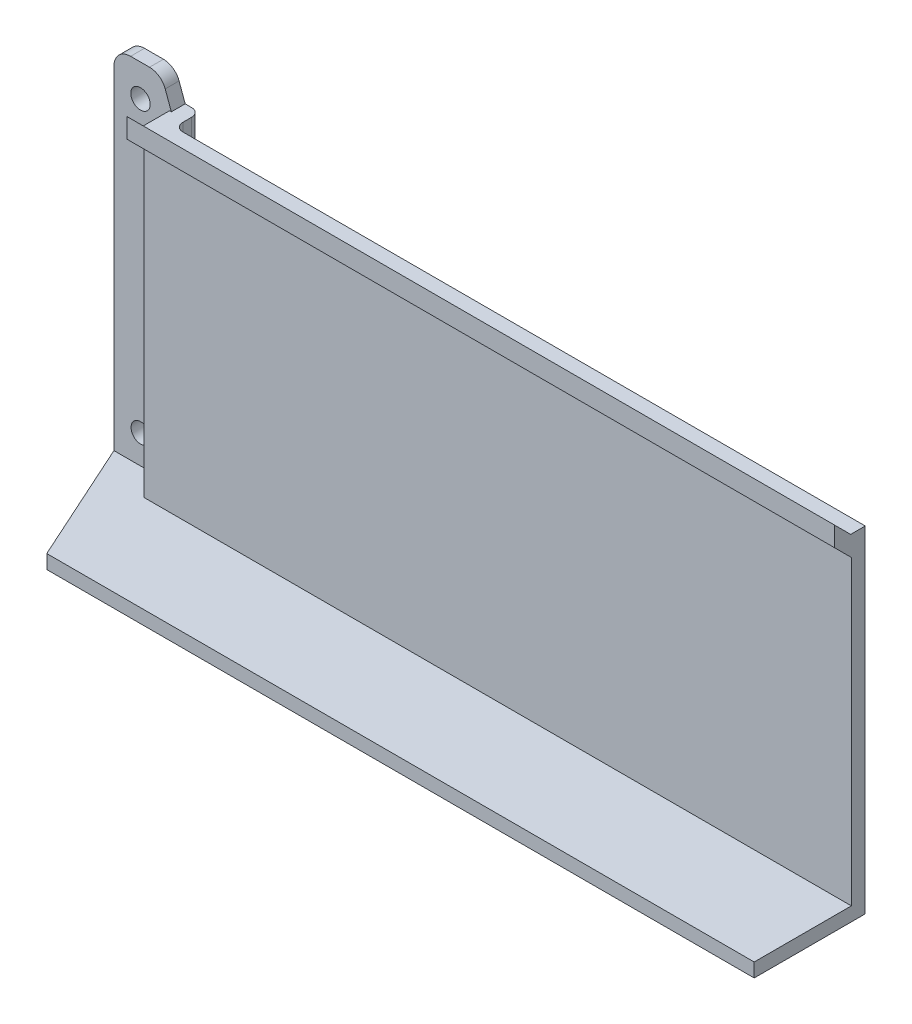
ISO-10303-21;
HEADER;
FILE_DESCRIPTION(('STEP AP214'),'2;1');
FILE_NAME('part.step','',(''),(''),'','','');
FILE_SCHEMA(('AUTOMOTIVE_DESIGN { 1 0 10303 214 1 1 1 1 }'));
ENDSEC;
DATA;
#1=APPLICATION_CONTEXT('core data for automotive mechanical design processes');
#2=APPLICATION_PROTOCOL_DEFINITION('international standard','automotive_design',2000,#1);
#3=PRODUCT_CONTEXT('',#1,'mechanical');
#4=PRODUCT('Part','Part','',(#3));
#5=PRODUCT_RELATED_PRODUCT_CATEGORY('part','',(#4));
#6=PRODUCT_DEFINITION_FORMATION('','',#4);
#7=PRODUCT_DEFINITION_CONTEXT('part definition',#1,'design');
#8=PRODUCT_DEFINITION('design','',#6,#7);
#9=PRODUCT_DEFINITION_SHAPE('','',#8);
#10=(LENGTH_UNIT() NAMED_UNIT(*) SI_UNIT(.MILLI.,.METRE.));
#11=(NAMED_UNIT(*) PLANE_ANGLE_UNIT() SI_UNIT($,.RADIAN.));
#12=(NAMED_UNIT(*) SI_UNIT($,.STERADIAN.) SOLID_ANGLE_UNIT());
#13=UNCERTAINTY_MEASURE_WITH_UNIT(LENGTH_MEASURE(1.E-05),#10,'distance_accuracy_value','');
#14=(GEOMETRIC_REPRESENTATION_CONTEXT(3) GLOBAL_UNCERTAINTY_ASSIGNED_CONTEXT((#13)) GLOBAL_UNIT_ASSIGNED_CONTEXT((#10,
#11,#12)) REPRESENTATION_CONTEXT('',''));
#15=CARTESIAN_POINT('',(0.,0.,0.));
#16=DIRECTION('',(0.,0.,1.));
#17=DIRECTION('',(1.,0.,0.));
#18=AXIS2_PLACEMENT_3D('',#15,#16,#17);
#19=CARTESIAN_POINT('',(273.3,-77.8,42.));
#20=DIRECTION('',(0.911071059253296,0.,-0.412249348078414));
#21=DIRECTION('',(0.,-1.,0.));
#22=AXIS2_PLACEMENT_3D('',#19,#20,#21);
#23=PLANE('',#22);
#24=DIRECTION('',(0.412249348078414,0.,0.911071059253296));
#25=VECTOR('',#24,1.);
#26=CARTESIAN_POINT('',(263.3,-77.8,19.9));
#27=LINE('',#26,#25);
#28=CARTESIAN_POINT('',(263.3,-77.8,19.9));
#29=VERTEX_POINT('',#28);
#30=CARTESIAN_POINT('',(273.3,-77.8,42.));
#31=VERTEX_POINT('',#30);
#32=EDGE_CURVE('E280',#29,#31,#27,.T.);
#33=ORIENTED_EDGE('',*,*,#32,.T.);
#34=DIRECTION('',(0.,1.,0.));
#35=VECTOR('',#34,1.);
#36=CARTESIAN_POINT('',(273.3,-61.952070743768,42.));
#37=LINE('',#36,#35);
#38=CARTESIAN_POINT('',(273.3,-75.3,42.));
#39=VERTEX_POINT('',#38);
#40=EDGE_CURVE('E435',#31,#39,#37,.T.);
#41=ORIENTED_EDGE('',*,*,#40,.T.);
#42=DIRECTION('',(-0.412249348078414,0.,-0.911071059253296));
#43=VECTOR('',#42,1.);
#44=CARTESIAN_POINT('',(263.3,-75.3,19.9));
#45=LINE('',#44,#43);
#46=CARTESIAN_POINT('',(263.3,-75.3,19.9));
#47=VERTEX_POINT('',#46);
#48=EDGE_CURVE('E193',#39,#47,#45,.T.);
#49=ORIENTED_EDGE('',*,*,#48,.T.);
#50=DIRECTION('',(0.,1.,0.));
#51=VECTOR('',#50,1.);
#52=CARTESIAN_POINT('',(263.3,-77.8,19.9));
#53=LINE('',#52,#51);
#54=EDGE_CURVE('E42',#29,#47,#53,.T.);
#55=ORIENTED_EDGE('',*,*,#54,.F.);
#56=EDGE_LOOP('',(#33,#41,#49,#55));
#57=FACE_BOUND('',#56,.T.);
#58=ADVANCED_FACE('F17',(#57),#23,.F.);
#59=CARTESIAN_POINT('',(267.15,-12.3,18.65));
#60=DIRECTION('',(0.,-1.,0.));
#61=DIRECTION('',(0.,0.,-1.));
#62=AXIS2_PLACEMENT_3D('',#59,#60,#61);
#63=PLANE('',#62);
#64=DIRECTION('',(0.,0.,1.));
#65=VECTOR('',#64,1.);
#66=CARTESIAN_POINT('',(266.3,-12.3,19.275));
#67=LINE('',#66,#65);
#68=CARTESIAN_POINT('',(266.3,-12.3,17.4));
#69=VERTEX_POINT('',#68);
#70=CARTESIAN_POINT('',(266.3,-12.3,19.9));
#71=VERTEX_POINT('',#70);
#72=EDGE_CURVE('E356',#69,#71,#67,.T.);
#73=ORIENTED_EDGE('',*,*,#72,.T.);
#74=DIRECTION('',(-1.,0.,0.));
#75=VECTOR('',#74,1.);
#76=CARTESIAN_POINT('',(261.3,-12.3,19.9));
#77=LINE('',#76,#75);
#78=CARTESIAN_POINT('',(269.712151148817,-12.3,19.9));
#79=VERTEX_POINT('',#78);
#80=EDGE_CURVE('E311',#79,#71,#77,.T.);
#81=ORIENTED_EDGE('',*,*,#80,.F.);
#82=DIRECTION('',(0.,0.,-1.));
#83=VECTOR('',#82,1.);
#84=CARTESIAN_POINT('',(269.712151148817,-12.3,18.025));
#85=LINE('',#84,#83);
#86=CARTESIAN_POINT('',(269.712151148817,-12.3,17.4));
#87=VERTEX_POINT('',#86);
#88=EDGE_CURVE('E278',#79,#87,#85,.T.);
#89=ORIENTED_EDGE('',*,*,#88,.T.);
#90=DIRECTION('',(1.,0.,0.));
#91=VECTOR('',#90,1.);
#92=CARTESIAN_POINT('',(273.,-12.3,17.4));
#93=LINE('',#92,#91);
#94=EDGE_CURVE('E11',#69,#87,#93,.T.);
#95=ORIENTED_EDGE('',*,*,#94,.F.);
#96=EDGE_LOOP('',(#73,#81,#89,#95));
#97=FACE_BOUND('',#96,.T.);
#98=ADVANCED_FACE('F721',(#97),#63,.F.);
#99=CARTESIAN_POINT('',(261.3,-77.8,17.4));
#100=DIRECTION('',(0.,0.,1.));
#101=DIRECTION('',(0.,-1.,0.));
#102=AXIS2_PLACEMENT_3D('',#99,#100,#101);
#103=PLANE('',#102);
#104=CARTESIAN_POINT('',(268.081503569987,-18.0495388462358,17.4));
#105=DIRECTION('',(0.,0.,-1.));
#106=DIRECTION('',(1.,0.,0.));
#107=AXIS2_PLACEMENT_3D('',#104,#105,#106);
#108=CIRCLE('',#107,1.74999999999997);
#109=CARTESIAN_POINT('',(266.331503569987,-18.0495388462358,17.4));
#110=VERTEX_POINT('',#109);
#111=EDGE_CURVE('E398',#110,#110,#108,.T.);
#112=ORIENTED_EDGE('',*,*,#111,.F.);
#113=EDGE_LOOP('',(#112));
#114=FACE_BOUND('',#113,.T.);
#115=CARTESIAN_POINT('',(268.132358944298,-70.1323589442977,17.4));
#116=DIRECTION('',(0.,0.,-1.));
#117=DIRECTION('',(1.,0.,0.));
#118=AXIS2_PLACEMENT_3D('',#115,#116,#117);
#119=CIRCLE('',#118,1.74999999999997);
#120=CARTESIAN_POINT('',(266.382358944298,-70.1323589442977,17.4));
#121=VERTEX_POINT('',#120);
#122=EDGE_CURVE('E155',#121,#121,#119,.T.);
#123=ORIENTED_EDGE('',*,*,#122,.F.);
#124=EDGE_LOOP('',(#123));
#125=FACE_BOUND('',#124,.T.);
#126=CARTESIAN_POINT('',(266.3,-15.3,17.4));
#127=DIRECTION('',(0.,0.,-1.));
#128=DIRECTION('',(-0.707106781186554,0.707106781186541,0.));
#129=AXIS2_PLACEMENT_3D('',#126,#127,#128);
#130=CIRCLE('',#129,3.);
#131=CARTESIAN_POINT('',(263.3,-15.3,17.4));
#132=VERTEX_POINT('',#131);
#133=EDGE_CURVE('E385',#132,#69,#130,.T.);
#134=ORIENTED_EDGE('',*,*,#133,.T.);
#135=ORIENTED_EDGE('',*,*,#94,.T.);
#136=CARTESIAN_POINT('',(269.712151148817,-15.3,17.4));
#137=DIRECTION('',(0.,0.,-1.));
#138=DIRECTION('',(0.573576436351047,0.819152044288991,0.));
#139=AXIS2_PLACEMENT_3D('',#136,#137,#138);
#140=CIRCLE('',#139,3.);
#141=CARTESIAN_POINT('',(272.531229011175,-14.273939570023,17.4));
#142=VERTEX_POINT('',#141);
#143=EDGE_CURVE('E274',#87,#142,#140,.T.);
#144=ORIENTED_EDGE('',*,*,#143,.T.);
#145=DIRECTION('',(-0.342020143325669,0.939692620785908,0.));
#146=VECTOR('',#145,1.);
#147=CARTESIAN_POINT('',(273.734751190158,-17.5805895805925,17.4));
#148=LINE('',#147,#146);
#149=CARTESIAN_POINT('',(273.632624934777,-17.3,17.4));
#150=VERTEX_POINT('',#149);
#151=EDGE_CURVE('E28',#150,#142,#148,.T.);
#152=ORIENTED_EDGE('',*,*,#151,.F.);
#153=DIRECTION('',(1.,0.,0.));
#154=VECTOR('',#153,1.);
#155=CARTESIAN_POINT('',(261.3,-17.3,17.4));
#156=LINE('',#155,#154);
#157=CARTESIAN_POINT('',(274.8,-17.3,17.4));
#158=VERTEX_POINT('',#157);
#159=EDGE_CURVE('E293',#150,#158,#156,.T.);
#160=ORIENTED_EDGE('',*,*,#159,.T.);
#161=DIRECTION('',(0.,-1.,0.));
#162=VECTOR('',#161,1.);
#163=CARTESIAN_POINT('',(274.8,-77.8,17.4));
#164=LINE('',#163,#162);
#165=CARTESIAN_POINT('',(274.8,-77.8,17.4));
#166=VERTEX_POINT('',#165);
#167=EDGE_CURVE('E288',#158,#166,#164,.T.);
#168=ORIENTED_EDGE('',*,*,#167,.T.);
#169=DIRECTION('',(1.,0.,0.));
#170=VECTOR('',#169,1.);
#171=CARTESIAN_POINT('',(261.3,-77.8,17.4));
#172=LINE('',#171,#170);
#173=CARTESIAN_POINT('',(263.3,-77.8,17.4));
#174=VERTEX_POINT('',#173);
#175=EDGE_CURVE('E284',#174,#166,#172,.T.);
#176=ORIENTED_EDGE('',*,*,#175,.F.);
#177=DIRECTION('',(0.,-1.,0.));
#178=VECTOR('',#177,1.);
#179=CARTESIAN_POINT('',(263.3,-77.8,17.4));
#180=LINE('',#179,#178);
#181=EDGE_CURVE('E283',#132,#174,#180,.T.);
#182=ORIENTED_EDGE('',*,*,#181,.F.);
#183=EDGE_LOOP('',(#134,#135,#144,#152,#160,#168,#176,#182));
#184=FACE_BOUND('',#183,.T.);
#185=ADVANCED_FACE('F681',(#114,#125,#184),#103,.F.);
#186=CARTESIAN_POINT('',(273.734751190158,-17.5805895805925,17.4));
#187=DIRECTION('',(-0.939692620785908,-0.342020143325669,0.));
#188=DIRECTION('',(-0.342020143325669,0.939692620785908,0.));
#189=AXIS2_PLACEMENT_3D('',#186,#187,#188);
#190=PLANE('',#189);
#191=DIRECTION('',(0.,0.,1.));
#192=VECTOR('',#191,1.);
#193=CARTESIAN_POINT('',(272.531229011175,-14.273939570023,18.025));
#194=LINE('',#193,#192);
#195=CARTESIAN_POINT('',(272.531229011175,-14.273939570023,19.9));
#196=VERTEX_POINT('',#195);
#197=EDGE_CURVE('E279',#142,#196,#194,.T.);
#198=ORIENTED_EDGE('',*,*,#197,.T.);
#199=DIRECTION('',(-0.342020143325669,0.939692620785908,0.));
#200=VECTOR('',#199,1.);
#201=CARTESIAN_POINT('',(273.734751190158,-17.5805895805925,19.9));
#202=LINE('',#201,#200);
#203=CARTESIAN_POINT('',(273.632624934777,-17.3,19.9));
#204=VERTEX_POINT('',#203);
#205=EDGE_CURVE('E307',#204,#196,#202,.T.);
#206=ORIENTED_EDGE('',*,*,#205,.F.);
#207=DIRECTION('',(0.,0.,-1.));
#208=VECTOR('',#207,1.);
#209=CARTESIAN_POINT('',(273.632624934777,-17.3,21.0121320343554));
#210=LINE('',#209,#208);
#211=EDGE_CURVE('E318',#204,#150,#210,.T.);
#212=ORIENTED_EDGE('',*,*,#211,.T.);
#213=ORIENTED_EDGE('',*,*,#151,.T.);
#214=EDGE_LOOP('',(#198,#206,#212,#213));
#215=FACE_BOUND('',#214,.T.);
#216=ADVANCED_FACE('F726',(#215),#190,.F.);
#217=CARTESIAN_POINT('',(263.3,-77.8,19.9));
#218=DIRECTION('',(-1.,0.,0.));
#219=DIRECTION('',(0.,0.,1.));
#220=AXIS2_PLACEMENT_3D('',#217,#218,#219);
#221=PLANE('',#220);
#222=DIRECTION('',(0.,0.,-1.));
#223=VECTOR('',#222,1.);
#224=CARTESIAN_POINT('',(263.3,-15.3,19.275));
#225=LINE('',#224,#223);
#226=CARTESIAN_POINT('',(263.3,-15.3,19.9));
#227=VERTEX_POINT('',#226);
#228=EDGE_CURVE('E417',#227,#132,#225,.T.);
#229=ORIENTED_EDGE('',*,*,#228,.T.);
#230=ORIENTED_EDGE('',*,*,#181,.T.);
#231=DIRECTION('',(0.,0.,1.));
#232=VECTOR('',#231,1.);
#233=CARTESIAN_POINT('',(263.3,-77.8,20.95));
#234=LINE('',#233,#232);
#235=EDGE_CURVE('E290',#174,#29,#234,.T.);
#236=ORIENTED_EDGE('',*,*,#235,.T.);
#237=ORIENTED_EDGE('',*,*,#54,.T.);
#238=DIRECTION('',(0.,1.,0.));
#239=VECTOR('',#238,1.);
#240=CARTESIAN_POINT('',(263.3,-77.8,19.9));
#241=LINE('',#240,#239);
#242=EDGE_CURVE('E327',#47,#227,#241,.T.);
#243=ORIENTED_EDGE('',*,*,#242,.T.);
#244=EDGE_LOOP('',(#229,#230,#236,#237,#243));
#245=FACE_BOUND('',#244,.T.);
#246=ADVANCED_FACE('F676',(#245),#221,.T.);
#247=CARTESIAN_POINT('',(273.,-77.8,22.));
#248=DIRECTION('',(0.,1.,0.));
#249=DIRECTION('',(0.,0.,-1.));
#250=AXIS2_PLACEMENT_3D('',#247,#248,#249);
#251=PLANE('',#250);
#252=ORIENTED_EDGE('',*,*,#235,.F.);
#253=ORIENTED_EDGE('',*,*,#175,.T.);
#254=CARTESIAN_POINT('',(274.8,-77.8,18.9));
#255=DIRECTION('',(0.,-1.,0.));
#256=DIRECTION('',(0.707106781186542,0.,-0.707106781186553));
#257=AXIS2_PLACEMENT_3D('',#254,#255,#256);
#258=CIRCLE('',#257,1.5);
#259=CARTESIAN_POINT('',(276.3,-77.8,18.9));
#260=VERTEX_POINT('',#259);
#261=EDGE_CURVE('E285',#166,#260,#258,.T.);
#262=ORIENTED_EDGE('',*,*,#261,.T.);
#263=DIRECTION('',(0.,0.,1.));
#264=VECTOR('',#263,1.);
#265=CARTESIAN_POINT('',(276.3,-77.8,17.4));
#266=LINE('',#265,#264);
#267=CARTESIAN_POINT('',(276.3,-77.8,20.5));
#268=VERTEX_POINT('',#267);
#269=EDGE_CURVE('E183',#260,#268,#266,.T.);
#270=ORIENTED_EDGE('',*,*,#269,.T.);
#271=CARTESIAN_POINT('',(277.8,-77.8,20.5));
#272=DIRECTION('',(0.,1.,0.));
#273=DIRECTION('',(-0.707106781186542,0.,0.707106781186553));
#274=AXIS2_PLACEMENT_3D('',#271,#272,#273);
#275=CIRCLE('',#274,1.5);
#276=CARTESIAN_POINT('',(277.8,-77.8,22.));
#277=VERTEX_POINT('',#276);
#278=EDGE_CURVE('E272',#268,#277,#275,.T.);
#279=ORIENTED_EDGE('',*,*,#278,.T.);
#280=DIRECTION('',(1.,0.,0.));
#281=VECTOR('',#280,1.);
#282=CARTESIAN_POINT('',(273.,-77.8,22.));
#283=LINE('',#282,#281);
#284=CARTESIAN_POINT('',(400.7,-77.8,22.));
#285=VERTEX_POINT('',#284);
#286=EDGE_CURVE('E172',#277,#285,#283,.T.);
#287=ORIENTED_EDGE('',*,*,#286,.T.);
#288=DIRECTION('',(0.,0.,1.));
#289=VECTOR('',#288,1.);
#290=CARTESIAN_POINT('',(400.7,-77.8,22.));
#291=LINE('',#290,#289);
#292=CARTESIAN_POINT('',(400.7,-77.8,42.));
#293=VERTEX_POINT('',#292);
#294=EDGE_CURVE('E337',#285,#293,#291,.T.);
#295=ORIENTED_EDGE('',*,*,#294,.T.);
#296=DIRECTION('',(1.,0.,0.));
#297=VECTOR('',#296,1.);
#298=CARTESIAN_POINT('',(273.,-77.8,42.));
#299=LINE('',#298,#297);
#300=EDGE_CURVE('E432',#31,#293,#299,.T.);
#301=ORIENTED_EDGE('',*,*,#300,.F.);
#302=ORIENTED_EDGE('',*,*,#32,.F.);
#303=EDGE_LOOP('',(#252,#253,#262,#270,#279,#287,#295,#301,#302));
#304=FACE_BOUND('',#303,.T.);
#305=ADVANCED_FACE('F668',(#304),#251,.F.);
#306=CARTESIAN_POINT('',(273.,-17.3,24.6242640687107));
#307=DIRECTION('',(0.,-1.,0.));
#308=DIRECTION('',(0.,0.,-1.));
#309=AXIS2_PLACEMENT_3D('',#306,#307,#308);
#310=PLANE('',#309);
#311=ORIENTED_EDGE('',*,*,#211,.F.);
#312=DIRECTION('',(1.,0.,0.));
#313=VECTOR('',#312,1.);
#314=CARTESIAN_POINT('',(273.3,-17.3,19.9));
#315=LINE('',#314,#313);
#316=CARTESIAN_POINT('',(273.3,-17.3,19.9));
#317=VERTEX_POINT('',#316);
#318=EDGE_CURVE('E312',#317,#204,#315,.T.);
#319=ORIENTED_EDGE('',*,*,#318,.F.);
#320=DIRECTION('',(0.,0.,-1.));
#321=VECTOR('',#320,1.);
#322=CARTESIAN_POINT('',(273.3,-17.3,28.3121320343554));
#323=LINE('',#322,#321);
#324=CARTESIAN_POINT('',(273.3,-17.3,24.6242640687107));
#325=VERTEX_POINT('',#324);
#326=EDGE_CURVE('E294',#325,#317,#323,.T.);
#327=ORIENTED_EDGE('',*,*,#326,.F.);
#328=DIRECTION('',(1.,0.,0.));
#329=VECTOR('',#328,1.);
#330=CARTESIAN_POINT('',(273.,-17.3,24.6242640687107));
#331=LINE('',#330,#329);
#332=CARTESIAN_POINT('',(400.7,-17.3,24.6242640687107));
#333=VERTEX_POINT('',#332);
#334=EDGE_CURVE('E317',#325,#333,#331,.T.);
#335=ORIENTED_EDGE('',*,*,#334,.T.);
#336=DIRECTION('',(0.,0.,-1.));
#337=VECTOR('',#336,1.);
#338=CARTESIAN_POINT('',(400.7,-17.3,24.6242640687107));
#339=LINE('',#338,#337);
#340=CARTESIAN_POINT('',(400.7,-17.3,22.));
#341=VERTEX_POINT('',#340);
#342=EDGE_CURVE('E425',#333,#341,#339,.T.);
#343=ORIENTED_EDGE('',*,*,#342,.T.);
#344=DIRECTION('',(1.,0.,0.));
#345=VECTOR('',#344,1.);
#346=CARTESIAN_POINT('',(273.,-17.3,22.));
#347=LINE('',#346,#345);
#348=CARTESIAN_POINT('',(277.8,-17.3,22.));
#349=VERTEX_POINT('',#348);
#350=EDGE_CURVE('E336',#349,#341,#347,.T.);
#351=ORIENTED_EDGE('',*,*,#350,.F.);
#352=CARTESIAN_POINT('',(277.8,-17.3,20.5));
#353=DIRECTION('',(0.,-1.,0.));
#354=DIRECTION('',(-0.707106781186542,0.,0.707106781186553));
#355=AXIS2_PLACEMENT_3D('',#352,#353,#354);
#356=CIRCLE('',#355,1.5);
#357=CARTESIAN_POINT('',(276.3,-17.3,20.5));
#358=VERTEX_POINT('',#357);
#359=EDGE_CURVE('E413',#349,#358,#356,.T.);
#360=ORIENTED_EDGE('',*,*,#359,.T.);
#361=DIRECTION('',(0.,0.,1.));
#362=VECTOR('',#361,1.);
#363=CARTESIAN_POINT('',(276.3,-17.3,17.4));
#364=LINE('',#363,#362);
#365=CARTESIAN_POINT('',(276.3,-17.3,18.9));
#366=VERTEX_POINT('',#365);
#367=EDGE_CURVE('E330',#366,#358,#364,.T.);
#368=ORIENTED_EDGE('',*,*,#367,.F.);
#369=CARTESIAN_POINT('',(274.8,-17.3,18.9));
#370=DIRECTION('',(0.,1.,0.));
#371=DIRECTION('',(0.707106781186542,0.,-0.707106781186553));
#372=AXIS2_PLACEMENT_3D('',#369,#370,#371);
#373=CIRCLE('',#372,1.5);
#374=EDGE_CURVE('E349',#366,#158,#373,.T.);
#375=ORIENTED_EDGE('',*,*,#374,.T.);
#376=ORIENTED_EDGE('',*,*,#159,.F.);
#377=EDGE_LOOP('',(#311,#319,#327,#335,#343,#351,#360,#368,#375,#376));
#378=FACE_BOUND('',#377,.T.);
#379=ADVANCED_FACE('F698',(#378),#310,.F.);
#380=CARTESIAN_POINT('',(276.3,-77.8,17.4));
#381=DIRECTION('',(-1.,0.,0.));
#382=DIRECTION('',(0.,0.,1.));
#383=AXIS2_PLACEMENT_3D('',#380,#381,#382);
#384=PLANE('',#383);
#385=DIRECTION('',(0.,1.,0.));
#386=VECTOR('',#385,1.);
#387=CARTESIAN_POINT('',(276.3,-77.8,18.9));
#388=LINE('',#387,#386);
#389=EDGE_CURVE('E289',#260,#366,#388,.T.);
#390=ORIENTED_EDGE('',*,*,#389,.T.);
#391=ORIENTED_EDGE('',*,*,#367,.T.);
#392=DIRECTION('',(0.,-1.,0.));
#393=VECTOR('',#392,1.);
#394=CARTESIAN_POINT('',(276.3,-47.55,20.5));
#395=LINE('',#394,#393);
#396=EDGE_CURVE('E21',#358,#268,#395,.T.);
#397=ORIENTED_EDGE('',*,*,#396,.T.);
#398=ORIENTED_EDGE('',*,*,#269,.F.);
#399=EDGE_LOOP('',(#390,#391,#397,#398));
#400=FACE_BOUND('',#399,.T.);
#401=ADVANCED_FACE('F689',(#400),#384,.F.);
#402=CARTESIAN_POINT('',(273.3,-77.8,19.9));
#403=DIRECTION('',(0.,0.,-1.));
#404=DIRECTION('',(-1.,0.,0.));
#405=AXIS2_PLACEMENT_3D('',#402,#403,#404);
#406=PLANE('',#405);
#407=CARTESIAN_POINT('',(268.132358944298,-70.1323589442977,19.9));
#408=DIRECTION('',(0.,0.,1.));
#409=DIRECTION('',(1.,0.,0.));
#410=AXIS2_PLACEMENT_3D('',#407,#408,#409);
#411=CIRCLE('',#410,1.74999999999997);
#412=CARTESIAN_POINT('',(266.382358944298,-70.1323589442977,19.9));
#413=VERTEX_POINT('',#412);
#414=EDGE_CURVE('E367',#413,#413,#411,.T.);
#415=ORIENTED_EDGE('',*,*,#414,.F.);
#416=EDGE_LOOP('',(#415));
#417=FACE_BOUND('',#416,.T.);
#418=CARTESIAN_POINT('',(268.081503569987,-18.0495388462358,19.9));
#419=DIRECTION('',(0.,0.,1.));
#420=DIRECTION('',(1.,0.,0.));
#421=AXIS2_PLACEMENT_3D('',#418,#419,#420);
#422=CIRCLE('',#421,1.74999999999997);
#423=CARTESIAN_POINT('',(266.331503569987,-18.0495388462358,19.9));
#424=VERTEX_POINT('',#423);
#425=EDGE_CURVE('E362',#424,#424,#422,.T.);
#426=ORIENTED_EDGE('',*,*,#425,.F.);
#427=EDGE_LOOP('',(#426));
#428=FACE_BOUND('',#427,.T.);
#429=DIRECTION('',(-1.,0.,0.));
#430=VECTOR('',#429,1.);
#431=CARTESIAN_POINT('',(270.8,-75.3,19.9));
#432=LINE('',#431,#430);
#433=CARTESIAN_POINT('',(273.3,-75.3,19.9));
#434=VERTEX_POINT('',#433);
#435=EDGE_CURVE('E352',#434,#47,#432,.T.);
#436=ORIENTED_EDGE('',*,*,#435,.F.);
#437=DIRECTION('',(0.,1.,0.));
#438=VECTOR('',#437,1.);
#439=CARTESIAN_POINT('',(273.3,-77.8,19.9));
#440=LINE('',#439,#438);
#441=EDGE_CURVE('E298',#434,#317,#440,.T.);
#442=ORIENTED_EDGE('',*,*,#441,.T.);
#443=ORIENTED_EDGE('',*,*,#318,.T.);
#444=ORIENTED_EDGE('',*,*,#205,.T.);
#445=CARTESIAN_POINT('',(269.712151148817,-15.3,19.9));
#446=DIRECTION('',(0.,0.,1.));
#447=DIRECTION('',(0.573576436351047,0.819152044288991,0.));
#448=AXIS2_PLACEMENT_3D('',#445,#446,#447);
#449=CIRCLE('',#448,3.);
#450=EDGE_CURVE('E360',#196,#79,#449,.T.);
#451=ORIENTED_EDGE('',*,*,#450,.T.);
#452=ORIENTED_EDGE('',*,*,#80,.T.);
#453=CARTESIAN_POINT('',(266.3,-15.3,19.9));
#454=DIRECTION('',(0.,0.,1.));
#455=DIRECTION('',(-0.707106781186554,0.707106781186541,0.));
#456=AXIS2_PLACEMENT_3D('',#453,#454,#455);
#457=CIRCLE('',#456,3.);
#458=EDGE_CURVE('E361',#71,#227,#457,.T.);
#459=ORIENTED_EDGE('',*,*,#458,.T.);
#460=ORIENTED_EDGE('',*,*,#242,.F.);
#461=EDGE_LOOP('',(#436,#442,#443,#444,#451,#452,#459,#460));
#462=FACE_BOUND('',#461,.T.);
#463=ADVANCED_FACE('F713',(#417,#428,#462),#406,.F.);
#464=CARTESIAN_POINT('',(273.,-14.408282975072,27.5159810936399));
#465=DIRECTION('',(0.,-0.707106781186693,0.707106781186402));
#466=DIRECTION('',(-1.,0.,0.));
#467=AXIS2_PLACEMENT_3D('',#464,#465,#466);
#468=PLANE('',#467);
#469=DIRECTION('',(0.,-0.707106781186402,-0.707106781186693));
#470=VECTOR('',#469,1.);
#471=CARTESIAN_POINT('',(273.3,-21.2112428765947,20.7130211921143));
#472=LINE('',#471,#470);
#473=CARTESIAN_POINT('',(273.3,-14.408282975072,27.5159810936399));
#474=VERTEX_POINT('',#473);
#475=EDGE_CURVE('E299',#474,#325,#472,.T.);
#476=ORIENTED_EDGE('',*,*,#475,.F.);
#477=DIRECTION('',(1.,0.,0.));
#478=VECTOR('',#477,1.);
#479=CARTESIAN_POINT('',(273.,-14.408282975072,27.5159810936399));
#480=LINE('',#479,#478);
#481=CARTESIAN_POINT('',(400.7,-14.408282975072,27.5159810936399));
#482=VERTEX_POINT('',#481);
#483=EDGE_CURVE('E313',#474,#482,#480,.T.);
#484=ORIENTED_EDGE('',*,*,#483,.T.);
#485=DIRECTION('',(0.,-0.707106781186402,-0.707106781186693));
#486=VECTOR('',#485,1.);
#487=CARTESIAN_POINT('',(400.7,-14.408282975072,27.5159810936399));
#488=LINE('',#487,#486);
#489=EDGE_CURVE('E421',#482,#333,#488,.T.);
#490=ORIENTED_EDGE('',*,*,#489,.T.);
#491=ORIENTED_EDGE('',*,*,#334,.F.);
#492=EDGE_LOOP('',(#476,#484,#490,#491));
#493=FACE_BOUND('',#492,.T.);
#494=ADVANCED_FACE('F703',(#493),#468,.F.);
#495=CARTESIAN_POINT('',(273.,-17.9438168810048,27.5159810936399));
#496=DIRECTION('',(0.,0.,-1.));
#497=DIRECTION('',(0.,-1.,0.));
#498=AXIS2_PLACEMENT_3D('',#495,#496,#497);
#499=PLANE('',#498);
#500=DIRECTION('',(0.,1.,0.));
#501=VECTOR('',#500,1.);
#502=CARTESIAN_POINT('',(273.3,-32.0239791842704,27.5159810936399));
#503=LINE('',#502,#501);
#504=CARTESIAN_POINT('',(273.3,-17.9438168810048,27.5159810936399));
#505=VERTEX_POINT('',#504);
#506=EDGE_CURVE('E257',#505,#474,#503,.T.);
#507=ORIENTED_EDGE('',*,*,#506,.F.);
#508=DIRECTION('',(1.,0.,0.));
#509=VECTOR('',#508,1.);
#510=CARTESIAN_POINT('',(273.,-17.9438168810048,27.5159810936399));
#511=LINE('',#510,#509);
#512=CARTESIAN_POINT('',(400.7,-17.9438168810048,27.5159810936399));
#513=VERTEX_POINT('',#512);
#514=EDGE_CURVE('E234',#505,#513,#511,.T.);
#515=ORIENTED_EDGE('',*,*,#514,.T.);
#516=DIRECTION('',(0.,1.,0.));
#517=VECTOR('',#516,1.);
#518=CARTESIAN_POINT('',(400.7,-17.9438168810048,27.5159810936399));
#519=LINE('',#518,#517);
#520=EDGE_CURVE('E389',#513,#482,#519,.T.);
#521=ORIENTED_EDGE('',*,*,#520,.T.);
#522=ORIENTED_EDGE('',*,*,#483,.F.);
#523=EDGE_LOOP('',(#507,#515,#521,#522));
#524=FACE_BOUND('',#523,.T.);
#525=ADVANCED_FACE('F707',(#524),#499,.F.);
#526=CARTESIAN_POINT('',(273.,-20.9597979746447,24.5));
#527=DIRECTION('',(0.,0.707106781186545,-0.70710678118655));
#528=DIRECTION('',(-1.,0.,0.));
#529=AXIS2_PLACEMENT_3D('',#526,#527,#528);
#530=PLANE('',#529);
#531=DIRECTION('',(0.,0.70710678118655,0.707106781186545));
#532=VECTOR('',#531,1.);
#533=CARTESIAN_POINT('',(273.3,-25.3708838528676,20.0889141217771));
#534=LINE('',#533,#532);
#535=CARTESIAN_POINT('',(273.3,-20.9597979746447,24.5));
#536=VERTEX_POINT('',#535);
#537=EDGE_CURVE('E252',#536,#505,#534,.T.);
#538=ORIENTED_EDGE('',*,*,#537,.F.);
#539=DIRECTION('',(1.,0.,0.));
#540=VECTOR('',#539,1.);
#541=CARTESIAN_POINT('',(273.,-20.9597979746447,24.5));
#542=LINE('',#541,#540);
#543=CARTESIAN_POINT('',(400.7,-20.9597979746447,24.5));
#544=VERTEX_POINT('',#543);
#545=EDGE_CURVE('E241',#536,#544,#542,.T.);
#546=ORIENTED_EDGE('',*,*,#545,.T.);
#547=DIRECTION('',(0.,0.70710678118655,0.707106781186545));
#548=VECTOR('',#547,1.);
#549=CARTESIAN_POINT('',(400.7,-20.9597979746447,24.5));
#550=LINE('',#549,#548);
#551=EDGE_CURVE('E303',#544,#513,#550,.T.);
#552=ORIENTED_EDGE('',*,*,#551,.T.);
#553=ORIENTED_EDGE('',*,*,#514,.F.);
#554=EDGE_LOOP('',(#538,#546,#552,#553));
#555=FACE_BOUND('',#554,.T.);
#556=ADVANCED_FACE('F253',(#555),#530,.F.);
#557=CARTESIAN_POINT('',(273.,-75.3,24.5));
#558=DIRECTION('',(0.,0.,-1.));
#559=DIRECTION('',(0.,-1.,0.));
#560=AXIS2_PLACEMENT_3D('',#557,#558,#559);
#561=PLANE('',#560);
#562=DIRECTION('',(0.,1.,0.));
#563=VECTOR('',#562,1.);
#564=CARTESIAN_POINT('',(273.3,-60.702070743768,24.5));
#565=LINE('',#564,#563);
#566=CARTESIAN_POINT('',(273.3,-75.3,24.5));
#567=VERTEX_POINT('',#566);
#568=EDGE_CURVE('E244',#567,#536,#565,.T.);
#569=ORIENTED_EDGE('',*,*,#568,.F.);
#570=DIRECTION('',(1.,0.,0.));
#571=VECTOR('',#570,1.);
#572=CARTESIAN_POINT('',(273.,-75.3,24.5));
#573=LINE('',#572,#571);
#574=CARTESIAN_POINT('',(400.7,-75.3,24.5));
#575=VERTEX_POINT('',#574);
#576=EDGE_CURVE('E355',#567,#575,#573,.T.);
#577=ORIENTED_EDGE('',*,*,#576,.T.);
#578=DIRECTION('',(0.,1.,0.));
#579=VECTOR('',#578,1.);
#580=CARTESIAN_POINT('',(400.7,-75.3,24.5));
#581=LINE('',#580,#579);
#582=EDGE_CURVE('E247',#575,#544,#581,.T.);
#583=ORIENTED_EDGE('',*,*,#582,.T.);
#584=ORIENTED_EDGE('',*,*,#545,.F.);
#585=EDGE_LOOP('',(#569,#577,#583,#584));
#586=FACE_BOUND('',#585,.T.);
#587=ADVANCED_FACE('F242',(#586),#561,.F.);
#588=CARTESIAN_POINT('',(273.,-75.3,42.));
#589=DIRECTION('',(0.,-1.,0.));
#590=DIRECTION('',(0.,0.,-1.));
#591=AXIS2_PLACEMENT_3D('',#588,#589,#590);
#592=PLANE('',#591);
#593=ORIENTED_EDGE('',*,*,#576,.F.);
#594=DIRECTION('',(0.,0.,-1.));
#595=VECTOR('',#594,1.);
#596=CARTESIAN_POINT('',(273.3,-75.3,31.475));
#597=LINE('',#596,#595);
#598=EDGE_CURVE('E261',#567,#434,#597,.T.);
#599=ORIENTED_EDGE('',*,*,#598,.T.);
#600=ORIENTED_EDGE('',*,*,#435,.T.);
#601=ORIENTED_EDGE('',*,*,#48,.F.);
#602=DIRECTION('',(1.,0.,0.));
#603=VECTOR('',#602,1.);
#604=CARTESIAN_POINT('',(273.,-75.3,42.));
#605=LINE('',#604,#603);
#606=CARTESIAN_POINT('',(400.7,-75.3,42.));
#607=VERTEX_POINT('',#606);
#608=EDGE_CURVE('E392',#39,#607,#605,.T.);
#609=ORIENTED_EDGE('',*,*,#608,.T.);
#610=DIRECTION('',(0.,0.,-1.));
#611=VECTOR('',#610,1.);
#612=CARTESIAN_POINT('',(400.7,-75.3,42.));
#613=LINE('',#612,#611);
#614=EDGE_CURVE('E302',#607,#575,#613,.T.);
#615=ORIENTED_EDGE('',*,*,#614,.T.);
#616=EDGE_LOOP('',(#593,#599,#600,#601,#609,#615));
#617=FACE_BOUND('',#616,.T.);
#618=ADVANCED_FACE('F675',(#617),#592,.F.);
#619=CARTESIAN_POINT('',(273.,-77.8,42.));
#620=DIRECTION('',(0.,0.,-1.));
#621=DIRECTION('',(0.,-1.,0.));
#622=AXIS2_PLACEMENT_3D('',#619,#620,#621);
#623=PLANE('',#622);
#624=ORIENTED_EDGE('',*,*,#40,.F.);
#625=ORIENTED_EDGE('',*,*,#300,.T.);
#626=DIRECTION('',(0.,1.,0.));
#627=VECTOR('',#626,1.);
#628=CARTESIAN_POINT('',(400.7,-77.8,42.));
#629=LINE('',#628,#627);
#630=EDGE_CURVE('E345',#293,#607,#629,.T.);
#631=ORIENTED_EDGE('',*,*,#630,.T.);
#632=ORIENTED_EDGE('',*,*,#608,.F.);
#633=EDGE_LOOP('',(#624,#625,#631,#632));
#634=FACE_BOUND('',#633,.T.);
#635=ADVANCED_FACE('F665',(#634),#623,.F.);
#636=CARTESIAN_POINT('',(273.,-17.3,22.));
#637=DIRECTION('',(0.,0.,1.));
#638=DIRECTION('',(1.,0.,0.));
#639=AXIS2_PLACEMENT_3D('',#636,#637,#638);
#640=PLANE('',#639);
#641=DIRECTION('',(0.,1.,0.));
#642=VECTOR('',#641,1.);
#643=CARTESIAN_POINT('',(277.8,-47.55,22.));
#644=LINE('',#643,#642);
#645=EDGE_CURVE('E268',#277,#349,#644,.T.);
#646=ORIENTED_EDGE('',*,*,#645,.T.);
#647=ORIENTED_EDGE('',*,*,#350,.T.);
#648=DIRECTION('',(0.,-1.,0.));
#649=VECTOR('',#648,1.);
#650=CARTESIAN_POINT('',(400.7,-17.3,22.));
#651=LINE('',#650,#649);
#652=EDGE_CURVE('E333',#341,#285,#651,.T.);
#653=ORIENTED_EDGE('',*,*,#652,.T.);
#654=ORIENTED_EDGE('',*,*,#286,.F.);
#655=EDGE_LOOP('',(#646,#647,#653,#654));
#656=FACE_BOUND('',#655,.T.);
#657=ADVANCED_FACE('F695',(#656),#640,.F.);
#658=CARTESIAN_POINT('',(400.7,-46.104141487536,32.));
#659=DIRECTION('',(-1.,0.,0.));
#660=DIRECTION('',(0.,0.,1.));
#661=AXIS2_PLACEMENT_3D('',#658,#659,#660);
#662=PLANE('',#661);
#663=ORIENTED_EDGE('',*,*,#342,.F.);
#664=ORIENTED_EDGE('',*,*,#489,.F.);
#665=ORIENTED_EDGE('',*,*,#520,.F.);
#666=ORIENTED_EDGE('',*,*,#551,.F.);
#667=ORIENTED_EDGE('',*,*,#582,.F.);
#668=ORIENTED_EDGE('',*,*,#614,.F.);
#669=ORIENTED_EDGE('',*,*,#630,.F.);
#670=ORIENTED_EDGE('',*,*,#294,.F.);
#671=ORIENTED_EDGE('',*,*,#652,.F.);
#672=EDGE_LOOP('',(#663,#664,#665,#666,#667,#668,#669,#670,#671));
#673=FACE_BOUND('',#672,.T.);
#674=ADVANCED_FACE('F672',(#673),#662,.F.);
#675=CARTESIAN_POINT('',(273.3,-46.104141487536,32.));
#676=DIRECTION('',(-1.,0.,0.));
#677=DIRECTION('',(0.,0.,1.));
#678=AXIS2_PLACEMENT_3D('',#675,#676,#677);
#679=PLANE('',#678);
#680=ORIENTED_EDGE('',*,*,#598,.F.);
#681=ORIENTED_EDGE('',*,*,#568,.T.);
#682=ORIENTED_EDGE('',*,*,#537,.T.);
#683=ORIENTED_EDGE('',*,*,#506,.T.);
#684=ORIENTED_EDGE('',*,*,#475,.T.);
#685=ORIENTED_EDGE('',*,*,#326,.T.);
#686=ORIENTED_EDGE('',*,*,#441,.F.);
#687=EDGE_LOOP('',(#680,#681,#682,#683,#684,#685,#686));
#688=FACE_BOUND('',#687,.T.);
#689=ADVANCED_FACE('F19',(#688),#679,.T.);
#690=CARTESIAN_POINT('',(277.8,-47.55,20.5));
#691=DIRECTION('',(0.,1.,0.));
#692=DIRECTION('',(-0.707106781186542,0.,0.707106781186553));
#693=AXIS2_PLACEMENT_3D('',#690,#691,#692);
#694=CYLINDRICAL_SURFACE('',#693,1.5);
#695=ORIENTED_EDGE('',*,*,#278,.F.);
#696=ORIENTED_EDGE('',*,*,#396,.F.);
#697=ORIENTED_EDGE('',*,*,#359,.F.);
#698=ORIENTED_EDGE('',*,*,#645,.F.);
#699=EDGE_LOOP('',(#695,#696,#697,#698));
#700=FACE_BOUND('',#699,.T.);
#701=ADVANCED_FACE('F694',(#700),#694,.F.);
#702=CARTESIAN_POINT('',(274.8,-77.8,18.9));
#703=DIRECTION('',(0.,-1.,0.));
#704=DIRECTION('',(0.707106781186542,0.,-0.707106781186553));
#705=AXIS2_PLACEMENT_3D('',#702,#703,#704);
#706=CYLINDRICAL_SURFACE('',#705,1.5);
#707=ORIENTED_EDGE('',*,*,#374,.F.);
#708=ORIENTED_EDGE('',*,*,#389,.F.);
#709=ORIENTED_EDGE('',*,*,#261,.F.);
#710=ORIENTED_EDGE('',*,*,#167,.F.);
#711=EDGE_LOOP('',(#707,#708,#709,#710));
#712=FACE_BOUND('',#711,.T.);
#713=ADVANCED_FACE('F687',(#712),#706,.T.);
#714=CARTESIAN_POINT('',(268.081503569987,-18.0495388462358,17.4));
#715=DIRECTION('',(0.,0.,-1.));
#716=DIRECTION('',(1.,0.,0.));
#717=AXIS2_PLACEMENT_3D('',#714,#715,#716);
#718=CYLINDRICAL_SURFACE('',#717,1.74999999999997);
#719=ORIENTED_EDGE('',*,*,#425,.T.);
#720=DIRECTION('',(0.,0.,-1.));
#721=VECTOR('',#720,1.);
#722=CARTESIAN_POINT('',(266.331503569987,-18.0495388462358,17.4));
#723=LINE('',#722,#721);
#724=EDGE_CURVE('E145',#424,#110,#723,.T.);
#725=ORIENTED_EDGE('',*,*,#724,.T.);
#726=ORIENTED_EDGE('',*,*,#111,.T.);
#727=ORIENTED_EDGE('',*,*,#724,.F.);
#728=EDGE_LOOP('',(#719,#725,#726,#727));
#729=FACE_BOUND('',#728,.T.);
#730=ADVANCED_FACE('F755',(#729),#718,.F.);
#731=CARTESIAN_POINT('',(268.132358944298,-70.1323589442977,17.4));
#732=DIRECTION('',(0.,0.,-1.));
#733=DIRECTION('',(1.,0.,0.));
#734=AXIS2_PLACEMENT_3D('',#731,#732,#733);
#735=CYLINDRICAL_SURFACE('',#734,1.74999999999997);
#736=ORIENTED_EDGE('',*,*,#414,.T.);
#737=DIRECTION('',(0.,0.,-1.));
#738=VECTOR('',#737,1.);
#739=CARTESIAN_POINT('',(266.382358944298,-70.1323589442977,17.4));
#740=LINE('',#739,#738);
#741=EDGE_CURVE('E370',#413,#121,#740,.T.);
#742=ORIENTED_EDGE('',*,*,#741,.T.);
#743=ORIENTED_EDGE('',*,*,#122,.T.);
#744=ORIENTED_EDGE('',*,*,#741,.F.);
#745=EDGE_LOOP('',(#736,#742,#743,#744));
#746=FACE_BOUND('',#745,.T.);
#747=ADVANCED_FACE('F758',(#746),#735,.F.);
#748=CARTESIAN_POINT('',(269.712151148817,-15.3,18.025));
#749=DIRECTION('',(0.,0.,-1.));
#750=DIRECTION('',(0.573576436351047,0.819152044288991,0.));
#751=AXIS2_PLACEMENT_3D('',#748,#749,#750);
#752=CYLINDRICAL_SURFACE('',#751,3.);
#753=ORIENTED_EDGE('',*,*,#450,.F.);
#754=ORIENTED_EDGE('',*,*,#197,.F.);
#755=ORIENTED_EDGE('',*,*,#143,.F.);
#756=ORIENTED_EDGE('',*,*,#88,.F.);
#757=EDGE_LOOP('',(#753,#754,#755,#756));
#758=FACE_BOUND('',#757,.T.);
#759=ADVANCED_FACE('F724',(#758),#752,.T.);
#760=CARTESIAN_POINT('',(266.3,-15.3,19.275));
#761=DIRECTION('',(0.,0.,1.));
#762=DIRECTION('',(-0.707106781186554,0.707106781186541,0.));
#763=AXIS2_PLACEMENT_3D('',#760,#761,#762);
#764=CYLINDRICAL_SURFACE('',#763,3.);
#765=ORIENTED_EDGE('',*,*,#133,.F.);
#766=ORIENTED_EDGE('',*,*,#228,.F.);
#767=ORIENTED_EDGE('',*,*,#458,.F.);
#768=ORIENTED_EDGE('',*,*,#72,.F.);
#769=EDGE_LOOP('',(#765,#766,#767,#768));
#770=FACE_BOUND('',#769,.T.);
#771=ADVANCED_FACE('F587',(#770),#764,.T.);
#772=CLOSED_SHELL('',(#58,#98,#185,#216,#246,#305,#379,#401,#463,#494,#525,#556,#587,#618,#635,
#657,#674,#689,#701,#713,#730,#747,#759,#771));
#773=MANIFOLD_SOLID_BREP('B1',#772);
#774=ADVANCED_BREP_SHAPE_REPRESENTATION('',(#18,#773),#14);
#775=SHAPE_DEFINITION_REPRESENTATION(#9,#774);
ENDSEC;
END-ISO-10303-21;
